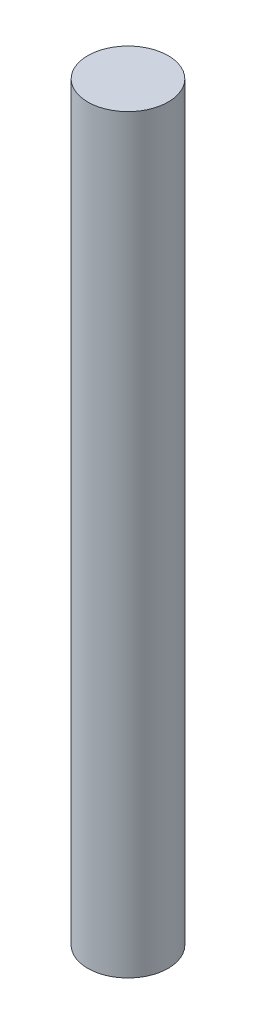
ISO-10303-21;
HEADER;
FILE_DESCRIPTION(('STEP AP214'),'2;1');
FILE_NAME('part.step','',(''),(''),'','','');
FILE_SCHEMA(('AUTOMOTIVE_DESIGN { 1 0 10303 214 1 1 1 1 }'));
ENDSEC;
DATA;
#1=APPLICATION_CONTEXT('core data for automotive mechanical design processes');
#2=APPLICATION_PROTOCOL_DEFINITION('international standard','automotive_design',2000,#1);
#3=PRODUCT_CONTEXT('',#1,'mechanical');
#4=PRODUCT('Part','Part','',(#3));
#5=PRODUCT_RELATED_PRODUCT_CATEGORY('part','',(#4));
#6=PRODUCT_DEFINITION_FORMATION('','',#4);
#7=PRODUCT_DEFINITION_CONTEXT('part definition',#1,'design');
#8=PRODUCT_DEFINITION('design','',#6,#7);
#9=PRODUCT_DEFINITION_SHAPE('','',#8);
#10=(LENGTH_UNIT() NAMED_UNIT(*) SI_UNIT(.MILLI.,.METRE.));
#11=(NAMED_UNIT(*) PLANE_ANGLE_UNIT() SI_UNIT($,.RADIAN.));
#12=(NAMED_UNIT(*) SI_UNIT($,.STERADIAN.) SOLID_ANGLE_UNIT());
#13=UNCERTAINTY_MEASURE_WITH_UNIT(LENGTH_MEASURE(1.E-05),#10,'distance_accuracy_value','');
#14=(GEOMETRIC_REPRESENTATION_CONTEXT(3) GLOBAL_UNCERTAINTY_ASSIGNED_CONTEXT((#13)) GLOBAL_UNIT_ASSIGNED_CONTEXT((#10,
#11,#12)) REPRESENTATION_CONTEXT('',''));
#15=CARTESIAN_POINT('',(0.,0.,0.));
#16=DIRECTION('',(0.,0.,1.));
#17=DIRECTION('',(1.,0.,0.));
#18=AXIS2_PLACEMENT_3D('',#15,#16,#17);
#19=CARTESIAN_POINT('',(0.,177.8,0.));
#20=DIRECTION('',(0.,-1.,0.));
#21=DIRECTION('',(0.,0.,-1.));
#22=AXIS2_PLACEMENT_3D('',#19,#20,#21);
#23=CYLINDRICAL_SURFACE('',#22,9.525);
#24=CARTESIAN_POINT('',(0.,177.8,0.));
#25=DIRECTION('',(0.,1.,0.));
#26=DIRECTION('',(0.,0.,1.));
#27=AXIS2_PLACEMENT_3D('',#24,#25,#26);
#28=CIRCLE('',#27,9.525);
#29=CARTESIAN_POINT('',(0.,177.8,9.525));
#30=VERTEX_POINT('',#29);
#31=EDGE_CURVE('E10',#30,#30,#28,.T.);
#32=ORIENTED_EDGE('',*,*,#31,.F.);
#33=EDGE_LOOP('',(#32));
#34=FACE_BOUND('',#33,.T.);
#35=CARTESIAN_POINT('',(0.,0.,0.));
#36=DIRECTION('',(0.,1.,0.));
#37=DIRECTION('',(0.,0.,1.));
#38=AXIS2_PLACEMENT_3D('',#35,#36,#37);
#39=CIRCLE('',#38,9.525);
#40=CARTESIAN_POINT('',(0.,0.,9.525));
#41=VERTEX_POINT('',#40);
#42=EDGE_CURVE('E35',#41,#41,#39,.T.);
#43=ORIENTED_EDGE('',*,*,#42,.T.);
#44=EDGE_LOOP('',(#43));
#45=FACE_BOUND('',#44,.T.);
#46=ADVANCED_FACE('F32',(#34,#45),#23,.T.);
#47=CARTESIAN_POINT('',(0.,177.8,0.));
#48=DIRECTION('',(0.,1.,0.));
#49=DIRECTION('',(0.,0.,1.));
#50=AXIS2_PLACEMENT_3D('',#47,#48,#49);
#51=PLANE('',#50);
#52=ORIENTED_EDGE('',*,*,#31,.T.);
#53=EDGE_LOOP('',(#52));
#54=FACE_BOUND('',#53,.T.);
#55=ADVANCED_FACE('F47',(#54),#51,.T.);
#56=CARTESIAN_POINT('',(0.,0.,0.));
#57=DIRECTION('',(0.,1.,0.));
#58=DIRECTION('',(0.,0.,1.));
#59=AXIS2_PLACEMENT_3D('',#56,#57,#58);
#60=PLANE('',#59);
#61=ORIENTED_EDGE('',*,*,#42,.F.);
#62=EDGE_LOOP('',(#61));
#63=FACE_BOUND('',#62,.T.);
#64=ADVANCED_FACE('F45',(#63),#60,.F.);
#65=CLOSED_SHELL('',(#46,#55,#64));
#66=MANIFOLD_SOLID_BREP('B2',#65);
#67=ADVANCED_BREP_SHAPE_REPRESENTATION('',(#18,#66),#14);
#68=SHAPE_DEFINITION_REPRESENTATION(#9,#67);
ENDSEC;
END-ISO-10303-21;
